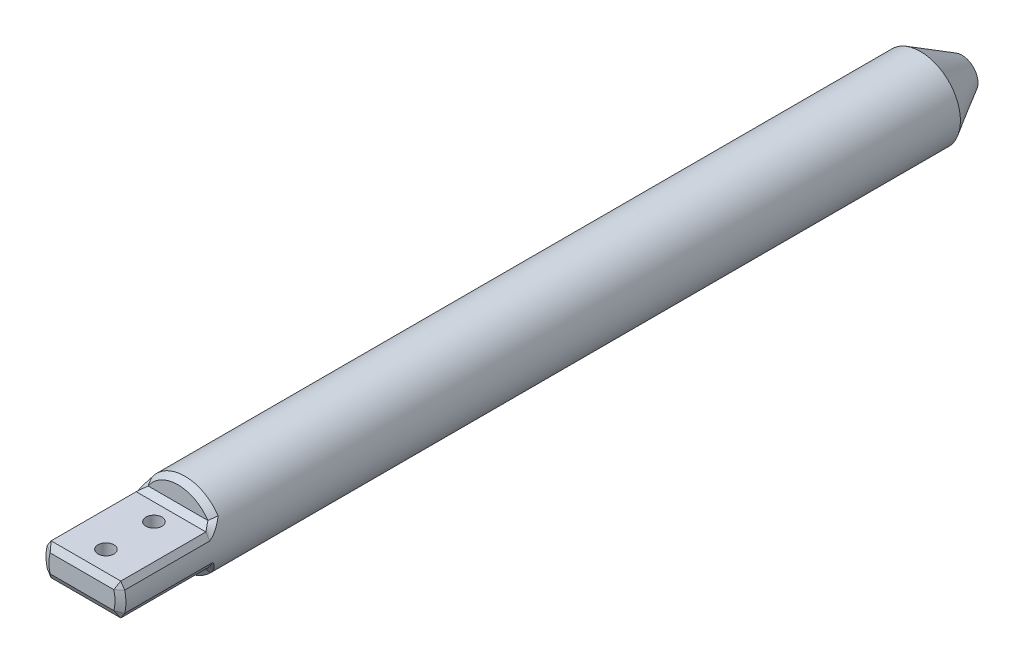
ISO-10303-21;
HEADER;
FILE_DESCRIPTION(('STEP AP214'),'2;1');
FILE_NAME('part.step','',(''),(''),'','','');
FILE_SCHEMA(('AUTOMOTIVE_DESIGN { 1 0 10303 214 1 1 1 1 }'));
ENDSEC;
DATA;
#1=APPLICATION_CONTEXT('core data for automotive mechanical design processes');
#2=APPLICATION_PROTOCOL_DEFINITION('international standard','automotive_design',2000,#1);
#3=PRODUCT_CONTEXT('',#1,'mechanical');
#4=PRODUCT('Part','Part','',(#3));
#5=PRODUCT_RELATED_PRODUCT_CATEGORY('part','',(#4));
#6=PRODUCT_DEFINITION_FORMATION('','',#4);
#7=PRODUCT_DEFINITION_CONTEXT('part definition',#1,'design');
#8=PRODUCT_DEFINITION('design','',#6,#7);
#9=PRODUCT_DEFINITION_SHAPE('','',#8);
#10=(LENGTH_UNIT() NAMED_UNIT(*) SI_UNIT(.MILLI.,.METRE.));
#11=(NAMED_UNIT(*) PLANE_ANGLE_UNIT() SI_UNIT($,.RADIAN.));
#12=(NAMED_UNIT(*) SI_UNIT($,.STERADIAN.) SOLID_ANGLE_UNIT());
#13=UNCERTAINTY_MEASURE_WITH_UNIT(LENGTH_MEASURE(1.E-05),#10,'distance_accuracy_value','');
#14=(GEOMETRIC_REPRESENTATION_CONTEXT(3) GLOBAL_UNCERTAINTY_ASSIGNED_CONTEXT((#13)) GLOBAL_UNIT_ASSIGNED_CONTEXT((#10,
#11,#12)) REPRESENTATION_CONTEXT('',''));
#15=CARTESIAN_POINT('',(0.,0.,0.));
#16=DIRECTION('',(0.,0.,1.));
#17=DIRECTION('',(1.,0.,0.));
#18=AXIS2_PLACEMENT_3D('',#15,#16,#17);
#19=CARTESIAN_POINT('',(0.,0.,110.));
#20=DIRECTION('',(0.,0.,-1.));
#21=DIRECTION('',(-1.,0.,0.));
#22=AXIS2_PLACEMENT_3D('',#19,#20,#21);
#23=CYLINDRICAL_SURFACE('',#22,5.);
#24=CARTESIAN_POINT('',(0.,0.,97.5));
#25=DIRECTION('',(0.,0.,1.));
#26=DIRECTION('',(1.,0.,0.));
#27=AXIS2_PLACEMENT_3D('',#24,#25,#26);
#28=CIRCLE('',#27,5.);
#29=CARTESIAN_POINT('',(3.60331431102539,-3.46642841783292,97.5));
#30=VERTEX_POINT('',#29);
#31=CARTESIAN_POINT('',(-3.60331431102539,-3.46642841783292,97.5));
#32=VERTEX_POINT('',#31);
#33=EDGE_CURVE('E603',#30,#32,#28,.F.);
#34=ORIENTED_EDGE('',*,*,#33,.T.);
#35=CARTESIAN_POINT('',(-4.83864352167007,-1.25997177357285,98.5));
#36=CARTESIAN_POINT('',(-4.83791114577477,-1.26278495482825,98.4946978248831));
#37=CARTESIAN_POINT('',(-4.83709577018911,-1.26590558939991,98.4895927835642));
#38=CARTESIAN_POINT('',(-4.83534131177357,-1.27259020517477,98.4797289513375));
#39=CARTESIAN_POINT('',(-4.83440269566841,-1.27615251101995,98.474968954316));
#40=CARTESIAN_POINT('',(-4.83147444635218,-1.28721117534268,98.4611672236894));
#41=CARTESIAN_POINT('',(-4.8293570416262,-1.29513865878249,98.4525058699072));
#42=CARTESIAN_POINT('',(-4.82296795322773,-1.31880017914286,98.428608200873));
#43=CARTESIAN_POINT('',(-4.81842942957423,-1.3353071419528,98.414233622582));
#44=CARTESIAN_POINT('',(-4.80888072189852,-1.3692999020264,98.3868612842947));
#45=CARTESIAN_POINT('',(-4.80386968090309,-1.38678745350685,98.3738661204037));
#46=CARTESIAN_POINT('',(-4.79337950997212,-1.4226267288188,98.34863068673));
#47=CARTESIAN_POINT('',(-4.78789393244556,-1.44098803322506,98.3364067590257));
#48=CARTESIAN_POINT('',(-4.77658218596247,-1.47805231913705,98.3127110717005));
#49=CARTESIAN_POINT('',(-4.77075637913052,-1.49675492330587,98.3012385389667));
#50=CARTESIAN_POINT('',(-4.75287903470475,-1.55295728881334,98.2678372368326));
#51=CARTESIAN_POINT('',(-4.7403528957484,-1.59080795853006,98.2467524992912));
#52=CARTESIAN_POINT('',(-4.71411921693592,-1.66694541992416,98.2061555446388));
#53=CARTESIAN_POINT('',(-4.70041120415756,-1.70523238081382,98.1866439631199));
#54=CARTESIAN_POINT('',(-4.65753757529481,-1.82045432872911,98.1298607433333));
#55=CARTESIAN_POINT('',(-4.62665474636726,-1.89764773362114,98.0943981647259));
#56=CARTESIAN_POINT('',(-4.56077692730352,-2.05090889943149,98.0270453815647));
#57=CARTESIAN_POINT('',(-4.52581878623369,-2.12698066420921,97.9951275891934));
#58=CARTESIAN_POINT('',(-4.45171487251678,-2.2780039456643,97.9337772548907));
#59=CARTESIAN_POINT('',(-4.41257211527258,-2.35295622523475,97.9043429503794));
#60=CARTESIAN_POINT('',(-4.33699380636204,-2.48907754548971,97.8521117313724));
#61=CARTESIAN_POINT('',(-4.30117777870619,-2.55047965329606,97.8290211626252));
#62=CARTESIAN_POINT('',(-4.22674785975603,-2.67201824569944,97.7839575746636));
#63=CARTESIAN_POINT('',(-4.18813298383377,-2.73215427519795,97.7619849534125));
#64=CARTESIAN_POINT('',(-4.10818437250475,-2.85095581894606,97.7189794346438));
#65=CARTESIAN_POINT('',(-4.06685005895411,-2.90962101681647,97.6979467385576));
#66=CARTESIAN_POINT('',(-3.98128492698696,-3.0256568581233,97.6565525855111));
#67=CARTESIAN_POINT('',(-3.93703767345193,-3.08301716445353,97.6361961244368));
#68=CARTESIAN_POINT('',(-3.84597525245467,-3.19589275652982,97.5961794342345));
#69=CARTESIAN_POINT('',(-3.79916059754885,-3.25140840701495,97.5765190674187));
#70=CARTESIAN_POINT('',(-3.70306669150843,-3.36044350451535,97.5378176614275));
#71=CARTESIAN_POINT('',(-3.65378849263906,-3.41396378705343,97.5187763634658));
#72=CARTESIAN_POINT('',(-3.60331431102539,-3.46642841783292,97.5));
#73=B_SPLINE_CURVE_WITH_KNOTS('',3,(#35,#36,#37,#38,#39,#40,#41,#42,#43,#44,#45,#46,#47,#48,#49,
#50,#51,#52,#53,#54,#55,#56,#57,#58,#59,#60,#61,#62,#63,#64,#65,#66,#67,#68,#69,#70,#71,#72),
.UNSPECIFIED.,.F.,.F.,(4,2,2,2,2,2,2,2,2,2,2,2,2,2,2,2,2,2,4),(0.,0.0181002082918333,
0.0361337464307406,0.0718579284492207,0.138771868201761,0.205809589128962,0.273973099392862,
0.342065336937103,0.477298371754491,0.612585772946951,0.883525739025791,1.15218233256534,
1.42064662268481,1.64479981007392,1.86903224036944,2.09331249678763,2.31898947279283,
2.54462155747039,2.77015807683253),.UNSPECIFIED.);
#74=CARTESIAN_POINT('',(-4.83864352167007,-1.25997177357285,98.5));
#75=VERTEX_POINT('',#74);
#76=EDGE_CURVE('E12',#32,#75,#73,.F.);
#77=ORIENTED_EDGE('',*,*,#76,.T.);
#78=DIRECTION('',(0.,0.,-1.));
#79=VECTOR('',#78,1.);
#80=CARTESIAN_POINT('',(-4.83864352167006,-1.25997177357285,110.));
#81=LINE('',#80,#79);
#82=CARTESIAN_POINT('',(-4.83864352167007,-1.25997177357285,109.5));
#83=VERTEX_POINT('',#82);
#84=EDGE_CURVE('E609',#75,#83,#81,.F.);
#85=ORIENTED_EDGE('',*,*,#84,.T.);
#86=CARTESIAN_POINT('',(0.,0.,109.5));
#87=DIRECTION('',(0.,0.,1.));
#88=DIRECTION('',(1.,0.,0.));
#89=AXIS2_PLACEMENT_3D('',#86,#87,#88);
#90=CIRCLE('',#89,5.);
#91=CARTESIAN_POINT('',(-4.83864352167006,1.25997177357285,109.5));
#92=VERTEX_POINT('',#91);
#93=EDGE_CURVE('E573',#83,#92,#90,.F.);
#94=ORIENTED_EDGE('',*,*,#93,.T.);
#95=DIRECTION('',(0.,0.,-1.));
#96=VECTOR('',#95,1.);
#97=CARTESIAN_POINT('',(-4.83864352167006,1.25997177357285,110.));
#98=LINE('',#97,#96);
#99=CARTESIAN_POINT('',(-4.83864352167006,1.25997177357285,98.8660254037844));
#100=VERTEX_POINT('',#99);
#101=EDGE_CURVE('E658',#92,#100,#98,.T.);
#102=ORIENTED_EDGE('',*,*,#101,.T.);
#103=CARTESIAN_POINT('',(-4.1573970964155,2.77777777777777,97.1339745962156));
#104=CARTESIAN_POINT('',(-4.18999144582304,2.7290066979412,97.1787698517985));
#105=CARTESIAN_POINT('',(-4.22163378587104,2.67977923219781,97.2237652760217));
#106=CARTESIAN_POINT('',(-4.28290834573235,2.58071153628058,97.314467466037));
#107=CARTESIAN_POINT('',(-4.31254016959463,2.53087118767541,97.3601743697815));
#108=CARTESIAN_POINT('',(-4.3698036588613,2.43067148976703,97.4528017566977));
#109=CARTESIAN_POINT('',(-4.39742569176498,2.38031081325133,97.4997267866347));
#110=CARTESIAN_POINT('',(-4.4504389150907,2.2796561285107,97.594877136005));
#111=CARTESIAN_POINT('',(-4.47583025415723,2.22936211606385,97.6431023685178));
#112=CARTESIAN_POINT('',(-4.54136428832915,2.09402864495546,97.7755610390604));
#113=CARTESIAN_POINT('',(-4.57934762961149,2.00938615272183,97.8613038400675));
#114=CARTESIAN_POINT('',(-4.63126118465874,1.88505755243007,97.994079313664));
#115=CARTESIAN_POINT('',(-4.64770295349641,1.8441084544682,98.0389666949668));
#116=CARTESIAN_POINT('',(-4.67894616188764,1.7633305646485,98.1303236282952));
#117=CARTESIAN_POINT('',(-4.69374718488855,1.72350205919315,98.176793578207));
#118=CARTESIAN_POINT('',(-4.72217298573088,1.64405629321745,98.2730125112414));
#119=CARTESIAN_POINT('',(-4.73574308092364,1.60448904523821,98.3228190712379));
#120=CARTESIAN_POINT('',(-4.76113594457901,1.5274893678067,98.4244517478379));
#121=CARTESIAN_POINT('',(-4.77295986022125,1.49005554678416,98.4762765100129));
#122=CARTESIAN_POINT('',(-4.78940368292854,1.43595695942918,98.5559453343732));
#123=CARTESIAN_POINT('',(-4.79468551616539,1.41820870130934,98.5829196240951));
#124=CARTESIAN_POINT('',(-4.8047864501276,1.38360106532777,98.6375110249733));
#125=CARTESIAN_POINT('',(-4.80960565297953,1.36674149165946,98.665127992577));
#126=CARTESIAN_POINT('',(-4.81877297359277,1.33405931891587,98.7211354781056));
#127=CARTESIAN_POINT('',(-4.82312002411845,1.31823909976782,98.7495275741319));
#128=CARTESIAN_POINT('',(-4.83128861397304,1.28798304259346,98.807138434298));
#129=CARTESIAN_POINT('',(-4.83510975318258,1.27354826112326,98.8363578076848));
#130=CARTESIAN_POINT('',(-4.83864352167006,1.25997177357285,98.8660254037844));
#131=B_SPLINE_CURVE_WITH_KNOTS('',3,(#103,#104,#105,#106,#107,#108,#109,#110,#111,#112,#113,
#114,#115,#116,#117,#118,#119,#120,#121,#122,#123,#124,#125,#126,#127,#128,#129,#130),
.UNSPECIFIED.,.F.,.F.,(4,2,2,2,2,2,2,2,2,2,2,2,2,4),(0.,0.221420341216524,0.442884163133895,
0.665347672896824,0.887796347321537,1.26642370584303,1.45521818859747,1.64406049326108,
1.83911249555734,2.03403577987126,2.13217432501867,2.23029115582921,2.32862534292581,
2.42703393505612),.UNSPECIFIED.);
#132=CARTESIAN_POINT('',(-4.1573970964155,2.77777777777777,97.1339745962156));
#133=VERTEX_POINT('',#132);
#134=EDGE_CURVE('E237',#133,#100,#131,.T.);
#135=ORIENTED_EDGE('',*,*,#134,.F.);
#136=CARTESIAN_POINT('',(0.,0.,97.1339745962156));
#137=DIRECTION('',(0.,0.,1.));
#138=DIRECTION('',(1.,0.,0.));
#139=AXIS2_PLACEMENT_3D('',#136,#137,#138);
#140=CIRCLE('',#139,5.);
#141=CARTESIAN_POINT('',(4.1573970964155,2.77777777777777,97.1339745962156));
#142=VERTEX_POINT('',#141);
#143=EDGE_CURVE('E218',#133,#142,#140,.F.);
#144=ORIENTED_EDGE('',*,*,#143,.T.);
#145=CARTESIAN_POINT('',(4.83864352167006,1.25997177357286,98.8660254037844));
#146=CARTESIAN_POINT('',(4.83458898174738,1.27555187103196,98.8320096043417));
#147=CARTESIAN_POINT('',(4.83016020376759,1.29224270478878,98.7985803966234));
#148=CARTESIAN_POINT('',(4.82062035095089,1.32738221084305,98.7327966258347));
#149=CARTESIAN_POINT('',(4.81550994098627,1.34582916524185,98.7004410534537));
#150=CARTESIAN_POINT('',(4.8046790909688,1.38399921384581,98.6367240544075));
#151=CARTESIAN_POINT('',(4.79896028099469,1.40371884500808,98.6053602494305));
#152=CARTESIAN_POINT('',(4.78692333116714,1.44423399416857,98.5434434058922));
#153=CARTESIAN_POINT('',(4.78060502210925,1.46502981515652,98.5128905993622));
#154=CARTESIAN_POINT('',(4.76087506170675,1.52840181261237,98.4228127261823));
#155=CARTESIAN_POINT('',(4.74660402744602,1.57226441194057,98.364377789047));
#156=CARTESIAN_POINT('',(4.71577497290737,1.66245097910402,98.2500203219606));
#157=CARTESIAN_POINT('',(4.69921526991065,1.70877674239095,98.1940996810838));
#158=CARTESIAN_POINT('',(4.66647976249786,1.79605060525544,98.092830457192));
#159=CARTESIAN_POINT('',(4.65062545190627,1.83675094003219,98.0471631236932));
#160=CARTESIAN_POINT('',(4.61725810005428,1.91908910791679,97.9573373290821));
#161=CARTESIAN_POINT('',(4.59974557821099,1.96072664436137,97.9131784013367));
#162=CARTESIAN_POINT('',(4.54461200746628,2.08684331910976,97.7825192959063));
#163=CARTESIAN_POINT('',(4.50446500397664,2.17233676726361,97.6980524961803));
#164=CARTESIAN_POINT('',(4.41684267594027,2.34543613145525,97.5319420664484));
#165=CARTESIAN_POINT('',(4.36925498024934,2.43305333186046,97.4503702620225));
#166=CARTESIAN_POINT('',(4.29316003966695,2.56345596721803,97.3302724402948));
#167=CARTESIAN_POINT('',(4.26705677973543,2.60668197007473,97.2906804328565));
#168=CARTESIAN_POINT('',(4.21334050705385,2.69264457746538,97.2120008845296));
#169=CARTESIAN_POINT('',(4.18572762356588,2.73538122352288,97.1729133008026));
#170=CARTESIAN_POINT('',(4.1573970964155,2.77777777777777,97.1339745962156));
#171=B_SPLINE_CURVE_WITH_KNOTS('',3,(#145,#146,#147,#148,#149,#150,#151,#152,#153,#154,#155,
#156,#157,#158,#159,#160,#161,#162,#163,#164,#165,#166,#167,#168,#169,#170),.UNSPECIFIED.,.F.,
.F.,(4,2,2,2,2,2,2,2,2,2,2,2,4),(0.,0.112833247447271,0.225557230003366,0.337986456353896,
0.450447510003236,0.673627588001006,0.896972638416056,1.08650154942326,1.27597128767746,
1.65579569547722,2.04203842998577,2.23452088078048,2.42698687592764),.UNSPECIFIED.);
#172=CARTESIAN_POINT('',(4.83864352167006,1.25997177357286,98.8660254037844));
#173=VERTEX_POINT('',#172);
#174=EDGE_CURVE('E208',#173,#142,#171,.T.);
#175=ORIENTED_EDGE('',*,*,#174,.F.);
#176=DIRECTION('',(0.,0.,-1.));
#177=VECTOR('',#176,1.);
#178=CARTESIAN_POINT('',(4.83864352167006,1.25997177357286,110.));
#179=LINE('',#178,#177);
#180=CARTESIAN_POINT('',(4.83864352167006,1.25997177357286,109.5));
#181=VERTEX_POINT('',#180);
#182=EDGE_CURVE('E656',#173,#181,#179,.F.);
#183=ORIENTED_EDGE('',*,*,#182,.T.);
#184=CARTESIAN_POINT('',(0.,0.,109.5));
#185=DIRECTION('',(0.,0.,1.));
#186=DIRECTION('',(1.,0.,0.));
#187=AXIS2_PLACEMENT_3D('',#184,#185,#186);
#188=CIRCLE('',#187,5.);
#189=CARTESIAN_POINT('',(4.83864352167007,-1.25997177357285,109.5));
#190=VERTEX_POINT('',#189);
#191=EDGE_CURVE('E653',#181,#190,#188,.F.);
#192=ORIENTED_EDGE('',*,*,#191,.T.);
#193=DIRECTION('',(0.,0.,-1.));
#194=VECTOR('',#193,1.);
#195=CARTESIAN_POINT('',(4.83864352167006,-1.25997177357285,110.));
#196=LINE('',#195,#194);
#197=CARTESIAN_POINT('',(4.83864352167007,-1.25997177357285,98.5));
#198=VERTEX_POINT('',#197);
#199=EDGE_CURVE('E647',#190,#198,#196,.T.);
#200=ORIENTED_EDGE('',*,*,#199,.T.);
#201=CARTESIAN_POINT('',(3.60331431102539,-3.46642841783292,97.5));
#202=CARTESIAN_POINT('',(3.65202035345034,-3.41580000550394,97.5181174534395));
#203=CARTESIAN_POINT('',(3.69960888203647,-3.36419525857177,97.5364817461299));
#204=CARTESIAN_POINT('',(3.79247760551225,-3.25914529307435,97.5737764898679));
#205=CARTESIAN_POINT('',(3.83775778165333,-3.20570005956647,97.5927069455118));
#206=CARTESIAN_POINT('',(3.9700449425102,-3.04274820318422,97.6504646872862));
#207=CARTESIAN_POINT('',(4.0534760852437,-2.93064881859808,97.6902500802594));
#208=CARTESIAN_POINT('',(4.21470240041271,-2.69405452156694,97.7756736011546));
#209=CARTESIAN_POINT('',(4.29188933373346,-2.56921779847032,97.8215174053492));
#210=CARTESIAN_POINT('',(4.39862282431041,-2.3785367925896,97.8944625768151));
#211=CARTESIAN_POINT('',(4.43269737924955,-2.31439534530826,97.9194783791065));
#212=CARTESIAN_POINT('',(4.49776337436799,-2.18525694452054,97.9712316893919));
#213=CARTESIAN_POINT('',(4.52875531797972,-2.12026013267656,97.9979689150752));
#214=CARTESIAN_POINT('',(4.58874986728373,-1.98718515525398,98.0546897555812));
#215=CARTESIAN_POINT('',(4.61762624175262,-1.91908636355318,98.0847597055306));
#216=CARTESIAN_POINT('',(4.65829532127212,-1.81703744075019,98.1321760201679));
#217=CARTESIAN_POINT('',(4.671401712461,-1.78306373683589,98.14835337799));
#218=CARTESIAN_POINT('',(4.69672470303182,-1.71525120944844,98.1816513115703));
#219=CARTESIAN_POINT('',(4.70894140152076,-1.68141237135013,98.1987717818965));
#220=CARTESIAN_POINT('',(4.7344813632306,-1.6082385185814,98.2372253160211));
#221=CARTESIAN_POINT('',(4.74763467953905,-1.56895698307482,98.2587770714112));
#222=CARTESIAN_POINT('',(4.76638082366708,-1.51064028530392,98.2928707529368));
#223=CARTESIAN_POINT('',(4.77247637400516,-1.49126551685596,98.3045539202937));
#224=CARTESIAN_POINT('',(4.78430325182178,-1.45287496610896,98.3286604459148));
#225=CARTESIAN_POINT('',(4.79003467546799,-1.43385908996512,98.3410836070494));
#226=CARTESIAN_POINT('',(4.80157955170935,-1.3947340328673,98.3680430633048));
#227=CARTESIAN_POINT('',(4.80735652649025,-1.37467423035488,98.3826691570357));
#228=CARTESIAN_POINT('',(4.81554456701524,-1.34559714930494,98.4058937878424));
#229=CARTESIAN_POINT('',(4.81818507608973,-1.33610819699121,98.4138166160376));
#230=CARTESIAN_POINT('',(4.82327882237037,-1.31760126242381,98.4302514772549));
#231=CARTESIAN_POINT('',(4.82573212707753,-1.30858311078574,98.4387632957713));
#232=CARTESIAN_POINT('',(4.8300997457424,-1.29236135385335,98.4555281047136));
#233=CARTESIAN_POINT('',(4.83204330993397,-1.28507054589167,98.4636862382102));
#234=CARTESIAN_POINT('',(4.83473333568819,-1.27489844606433,98.4766405978463));
#235=CARTESIAN_POINT('',(4.83559549253994,-1.27162337958873,98.4810978183009));
#236=CARTESIAN_POINT('',(4.83721074719702,-1.26546539508924,98.4903123643399));
#237=CARTESIAN_POINT('',(4.83796349013983,-1.26258375482313,98.4950705976104));
#238=CARTESIAN_POINT('',(4.83864352166735,-1.25997177357769,98.4999999999978));
#239=B_SPLINE_CURVE_WITH_KNOTS('',3,(#201,#202,#203,#204,#205,#206,#207,#208,#209,#210,#211,
#212,#213,#214,#215,#216,#217,#218,#219,#220,#221,#222,#223,#224,#225,#226,#227,#228,#229,#230,
#231,#232,#233,#234,#235,#236,#237,#238),.UNSPECIFIED.,.F.,.F.,(4,2,2,2,2,2,2,2,2,2,2,2,2,2,2,2,
2,2,4),(0.,0.217625187499162,0.435252142281957,0.870606166500743,1.3312303484465,
1.56161329193997,1.79195854876834,2.0313659227303,2.15088612661754,2.27039299616369,
2.41041087147184,2.48069161482942,2.55095371886457,2.62734649906397,2.66525191129714,
2.70314359060441,2.73641782304225,2.75319169163709,2.77001880393019),.UNSPECIFIED.);
#240=EDGE_CURVE('E55',#198,#30,#239,.F.);
#241=ORIENTED_EDGE('',*,*,#240,.T.);
#242=EDGE_LOOP('',(#34,#77,#85,#94,#102,#135,#144,#175,#183,#192,#200,#241));
#243=FACE_BOUND('',#242,.T.);
#244=CARTESIAN_POINT('',(0.,0.,5.19615242270667));
#245=DIRECTION('',(0.,0.,1.));
#246=DIRECTION('',(1.,0.,0.));
#247=AXIS2_PLACEMENT_3D('',#244,#245,#246);
#248=CIRCLE('',#247,5.);
#249=CARTESIAN_POINT('',(5.,0.,5.19615242270667));
#250=VERTEX_POINT('',#249);
#251=EDGE_CURVE('E550',#250,#250,#248,.T.);
#252=ORIENTED_EDGE('',*,*,#251,.T.);
#253=EDGE_LOOP('',(#252));
#254=FACE_BOUND('',#253,.T.);
#255=ADVANCED_FACE('F44',(#243,#254),#23,.T.);
#256=CARTESIAN_POINT('',(0.,0.,110.));
#257=DIRECTION('',(0.,0.,1.));
#258=DIRECTION('',(1.,0.,0.));
#259=AXIS2_PLACEMENT_3D('',#256,#257,#258);
#260=PLANE('',#259);
#261=CARTESIAN_POINT('',(0.,0.,110.));
#262=DIRECTION('',(0.,0.,1.));
#263=DIRECTION('',(1.,0.,0.));
#264=AXIS2_PLACEMENT_3D('',#261,#262,#263);
#265=CIRCLE('',#264,4.13397459621556);
#266=CARTESIAN_POINT('',(-3.97540533496817,1.13397459621556,110.));
#267=VERTEX_POINT('',#266);
#268=CARTESIAN_POINT('',(-3.97540533496817,-1.13397459621556,110.));
#269=VERTEX_POINT('',#268);
#270=EDGE_CURVE('E189',#267,#269,#265,.T.);
#271=ORIENTED_EDGE('',*,*,#270,.T.);
#272=DIRECTION('',(1.,0.,0.));
#273=VECTOR('',#272,1.);
#274=CARTESIAN_POINT('',(0.,-1.13397459621556,110.));
#275=LINE('',#274,#273);
#276=CARTESIAN_POINT('',(3.97540533496817,-1.13397459621556,110.));
#277=VERTEX_POINT('',#276);
#278=EDGE_CURVE('E156',#269,#277,#275,.T.);
#279=ORIENTED_EDGE('',*,*,#278,.T.);
#280=CARTESIAN_POINT('',(0.,0.,110.));
#281=DIRECTION('',(0.,0.,1.));
#282=DIRECTION('',(1.,0.,0.));
#283=AXIS2_PLACEMENT_3D('',#280,#281,#282);
#284=CIRCLE('',#283,4.13397459621556);
#285=CARTESIAN_POINT('',(3.97540533496817,1.13397459621556,110.));
#286=VERTEX_POINT('',#285);
#287=EDGE_CURVE('E177',#277,#286,#284,.T.);
#288=ORIENTED_EDGE('',*,*,#287,.T.);
#289=DIRECTION('',(-1.,0.,0.));
#290=VECTOR('',#289,1.);
#291=CARTESIAN_POINT('',(0.,1.13397459621556,110.));
#292=LINE('',#291,#290);
#293=EDGE_CURVE('E184',#286,#267,#292,.T.);
#294=ORIENTED_EDGE('',*,*,#293,.T.);
#295=EDGE_LOOP('',(#271,#279,#288,#294));
#296=FACE_BOUND('',#295,.T.);
#297=ADVANCED_FACE('F187',(#296),#260,.T.);
#298=CARTESIAN_POINT('',(0.,0.,0.));
#299=DIRECTION('',(0.,0.,1.));
#300=DIRECTION('',(1.,0.,0.));
#301=AXIS2_PLACEMENT_3D('',#298,#299,#300);
#302=PLANE('',#301);
#303=CARTESIAN_POINT('',(0.,0.,0.));
#304=DIRECTION('',(0.,0.,1.));
#305=DIRECTION('',(1.,0.,0.));
#306=AXIS2_PLACEMENT_3D('',#303,#304,#305);
#307=CIRCLE('',#306,1.99999999999997);
#308=CARTESIAN_POINT('',(1.99999999999997,0.,0.));
#309=VERTEX_POINT('',#308);
#310=EDGE_CURVE('E185',#309,#309,#307,.F.);
#311=ORIENTED_EDGE('',*,*,#310,.T.);
#312=EDGE_LOOP('',(#311));
#313=FACE_BOUND('',#312,.T.);
#314=ADVANCED_FACE('F230',(#313),#302,.F.);
#315=CARTESIAN_POINT('',(0.,0.,5.19615242270667));
#316=DIRECTION('',(0.,0.,1.));
#317=DIRECTION('',(1.,0.,0.));
#318=AXIS2_PLACEMENT_3D('',#315,#316,#317);
#319=CONICAL_SURFACE('',#318,5.,0.5235987755983);
#320=ORIENTED_EDGE('',*,*,#310,.F.);
#321=EDGE_LOOP('',(#320));
#322=FACE_BOUND('',#321,.T.);
#323=ORIENTED_EDGE('',*,*,#251,.F.);
#324=EDGE_LOOP('',(#323));
#325=FACE_BOUND('',#324,.T.);
#326=ADVANCED_FACE('F233',(#322,#325),#319,.T.);
#327=CARTESIAN_POINT('',(-5.,-2.,98.));
#328=DIRECTION('',(0.,-1.,0.));
#329=DIRECTION('',(1.,0.,0.));
#330=AXIS2_PLACEMENT_3D('',#327,#328,#329);
#331=PLANE('',#330);
#332=CARTESIAN_POINT('',(0.,-2.,101.));
#333=DIRECTION('',(0.,-1.,0.));
#334=DIRECTION('',(1.,0.,0.));
#335=AXIS2_PLACEMENT_3D('',#332,#333,#334);
#336=CIRCLE('',#335,0.999999999999988);
#337=CARTESIAN_POINT('',(0.999999999999983,-2.,101.));
#338=VERTEX_POINT('',#337);
#339=EDGE_CURVE('E871',#338,#338,#336,.T.);
#340=ORIENTED_EDGE('',*,*,#339,.F.);
#341=EDGE_LOOP('',(#340));
#342=FACE_BOUND('',#341,.T.);
#343=CARTESIAN_POINT('',(0.,-2.,107.));
#344=DIRECTION('',(0.,-1.,0.));
#345=DIRECTION('',(1.,0.,0.));
#346=AXIS2_PLACEMENT_3D('',#343,#344,#345);
#347=CIRCLE('',#346,0.999999999999988);
#348=CARTESIAN_POINT('',(0.999999999999988,-2.,107.));
#349=VERTEX_POINT('',#348);
#350=EDGE_CURVE('E163',#349,#349,#347,.T.);
#351=ORIENTED_EDGE('',*,*,#350,.F.);
#352=EDGE_LOOP('',(#351));
#353=FACE_BOUND('',#352,.T.);
#354=DIRECTION('',(0.,0.,1.));
#355=VECTOR('',#354,1.);
#356=CARTESIAN_POINT('',(4.35477916950306,-2.,110.));
#357=LINE('',#356,#355);
#358=CARTESIAN_POINT('',(4.35477916950306,-2.,98.5));
#359=VERTEX_POINT('',#358);
#360=CARTESIAN_POINT('',(4.35477916950306,-2.,109.5));
#361=VERTEX_POINT('',#360);
#362=EDGE_CURVE('E196',#359,#361,#357,.T.);
#363=ORIENTED_EDGE('',*,*,#362,.T.);
#364=DIRECTION('',(-1.,0.,0.));
#365=VECTOR('',#364,1.);
#366=CARTESIAN_POINT('',(-5.,-2.,109.5));
#367=LINE('',#366,#365);
#368=CARTESIAN_POINT('',(-4.35477916950306,-2.,109.5));
#369=VERTEX_POINT('',#368);
#370=EDGE_CURVE('E158',#361,#369,#367,.T.);
#371=ORIENTED_EDGE('',*,*,#370,.T.);
#372=DIRECTION('',(0.,0.,-1.));
#373=VECTOR('',#372,1.);
#374=CARTESIAN_POINT('',(-4.35477916950306,-2.,98.));
#375=LINE('',#374,#373);
#376=CARTESIAN_POINT('',(-4.35477916950306,-2.,98.5));
#377=VERTEX_POINT('',#376);
#378=EDGE_CURVE('E203',#369,#377,#375,.T.);
#379=ORIENTED_EDGE('',*,*,#378,.T.);
#380=DIRECTION('',(1.,0.,0.));
#381=VECTOR('',#380,1.);
#382=CARTESIAN_POINT('',(4.58257569495584,-2.,98.5));
#383=LINE('',#382,#381);
#384=EDGE_CURVE('E192',#377,#359,#383,.T.);
#385=ORIENTED_EDGE('',*,*,#384,.T.);
#386=EDGE_LOOP('',(#363,#371,#379,#385));
#387=FACE_BOUND('',#386,.T.);
#388=ADVANCED_FACE('F642',(#342,#353,#387),#331,.T.);
#389=CARTESIAN_POINT('',(0.,0.,98.));
#390=DIRECTION('',(0.,0.,1.));
#391=DIRECTION('',(1.,0.,0.));
#392=AXIS2_PLACEMENT_3D('',#389,#390,#391);
#393=PLANE('',#392);
#394=CARTESIAN_POINT('',(0.,0.,98.));
#395=DIRECTION('',(0.,0.,1.));
#396=DIRECTION('',(1.,0.,0.));
#397=AXIS2_PLACEMENT_3D('',#394,#395,#396);
#398=CIRCLE('',#397,4.13397459621556);
#399=CARTESIAN_POINT('',(-2.97920196479179,-2.8660254037842,98.));
#400=VERTEX_POINT('',#399);
#401=CARTESIAN_POINT('',(2.97920196479179,-2.8660254037842,98.));
#402=VERTEX_POINT('',#401);
#403=EDGE_CURVE('E617',#400,#402,#398,.T.);
#404=ORIENTED_EDGE('',*,*,#403,.T.);
#405=DIRECTION('',(-1.,0.,0.));
#406=VECTOR('',#405,1.);
#407=CARTESIAN_POINT('',(-4.58257569495584,-2.86602540378444,98.));
#408=LINE('',#407,#406);
#409=EDGE_CURVE('E620',#402,#400,#408,.T.);
#410=ORIENTED_EDGE('',*,*,#409,.T.);
#411=EDGE_LOOP('',(#404,#410));
#412=FACE_BOUND('',#411,.T.);
#413=ADVANCED_FACE('F626',(#412),#393,.T.);
#414=DIRECTION('',(1.,0.,0.));
#415=VECTOR('',#414,1.);
#416=CARTESIAN_POINT('',(4.58257569495584,2.49999999999999,98.));
#417=LINE('',#416,#415);
#418=CARTESIAN_POINT('',(-3.74165738677395,2.49999999999999,98.));
#419=VERTEX_POINT('',#418);
#420=CARTESIAN_POINT('',(3.74165738677395,2.49999999999999,98.));
#421=VERTEX_POINT('',#420);
#422=EDGE_CURVE('E62',#419,#421,#417,.T.);
#423=ORIENTED_EDGE('',*,*,#422,.T.);
#424=CARTESIAN_POINT('',(0.,0.,98.));
#425=DIRECTION('',(0.,0.,1.));
#426=DIRECTION('',(1.,0.,0.));
#427=AXIS2_PLACEMENT_3D('',#424,#425,#426);
#428=CIRCLE('',#427,4.50000000000001);
#429=EDGE_CURVE('E251',#421,#419,#428,.T.);
#430=ORIENTED_EDGE('',*,*,#429,.T.);
#431=EDGE_LOOP('',(#423,#430));
#432=FACE_BOUND('',#431,.T.);
#433=ADVANCED_FACE('F809',(#432),#393,.T.);
#434=CARTESIAN_POINT('',(-5.,2.,98.));
#435=DIRECTION('',(0.,1.,0.));
#436=DIRECTION('',(-1.,0.,0.));
#437=AXIS2_PLACEMENT_3D('',#434,#435,#436);
#438=PLANE('',#437);
#439=CARTESIAN_POINT('',(0.,2.,101.));
#440=DIRECTION('',(0.,1.,0.));
#441=DIRECTION('',(0.,0.,1.));
#442=AXIS2_PLACEMENT_3D('',#439,#440,#441);
#443=CIRCLE('',#442,0.999999999999989);
#444=CARTESIAN_POINT('',(0.,2.,102.));
#445=VERTEX_POINT('',#444);
#446=EDGE_CURVE('E881',#445,#445,#443,.T.);
#447=ORIENTED_EDGE('',*,*,#446,.F.);
#448=EDGE_LOOP('',(#447));
#449=FACE_BOUND('',#448,.T.);
#450=CARTESIAN_POINT('',(0.,2.,107.));
#451=DIRECTION('',(0.,1.,0.));
#452=DIRECTION('',(0.,0.,1.));
#453=AXIS2_PLACEMENT_3D('',#450,#451,#452);
#454=CIRCLE('',#453,0.999999999999989);
#455=CARTESIAN_POINT('',(0.,2.,108.));
#456=VERTEX_POINT('',#455);
#457=EDGE_CURVE('E875',#456,#456,#454,.T.);
#458=ORIENTED_EDGE('',*,*,#457,.F.);
#459=EDGE_LOOP('',(#458));
#460=FACE_BOUND('',#459,.T.);
#461=DIRECTION('',(0.,0.,1.));
#462=VECTOR('',#461,1.);
#463=CARTESIAN_POINT('',(-4.35477916950306,2.,110.));
#464=LINE('',#463,#462);
#465=CARTESIAN_POINT('',(-4.35477916950306,2.,98.8660254037844));
#466=VERTEX_POINT('',#465);
#467=CARTESIAN_POINT('',(-4.35477916950306,2.,109.5));
#468=VERTEX_POINT('',#467);
#469=EDGE_CURVE('E602',#466,#468,#464,.T.);
#470=ORIENTED_EDGE('',*,*,#469,.T.);
#471=DIRECTION('',(1.,0.,0.));
#472=VECTOR('',#471,1.);
#473=CARTESIAN_POINT('',(-5.,2.,109.5));
#474=LINE('',#473,#472);
#475=CARTESIAN_POINT('',(4.35477916950306,2.,109.5));
#476=VERTEX_POINT('',#475);
#477=EDGE_CURVE('E567',#468,#476,#474,.T.);
#478=ORIENTED_EDGE('',*,*,#477,.T.);
#479=DIRECTION('',(0.,0.,-1.));
#480=VECTOR('',#479,1.);
#481=CARTESIAN_POINT('',(4.35477916950306,2.,98.));
#482=LINE('',#481,#480);
#483=CARTESIAN_POINT('',(4.35477916950306,2.,98.8660254037844));
#484=VERTEX_POINT('',#483);
#485=EDGE_CURVE('E607',#476,#484,#482,.T.);
#486=ORIENTED_EDGE('',*,*,#485,.T.);
#487=DIRECTION('',(-1.,0.,0.));
#488=VECTOR('',#487,1.);
#489=CARTESIAN_POINT('',(-4.58257569495584,2.,98.8660254037844));
#490=LINE('',#489,#488);
#491=EDGE_CURVE('E599',#484,#466,#490,.T.);
#492=ORIENTED_EDGE('',*,*,#491,.T.);
#493=EDGE_LOOP('',(#470,#478,#486,#492));
#494=FACE_BOUND('',#493,.T.);
#495=ADVANCED_FACE('F802',(#449,#460,#494),#438,.T.);
#496=CARTESIAN_POINT('',(-5.,2.,98.8660254037844));
#497=DIRECTION('',(0.,0.866025403784439,0.499999999999999));
#498=DIRECTION('',(1.,0.,0.));
#499=AXIS2_PLACEMENT_3D('',#496,#497,#498);
#500=PLANE('',#499);
#501=CARTESIAN_POINT('',(3.74165738677395,2.49999999999999,98.));
#502=CARTESIAN_POINT('',(3.82349449456611,2.43326194722043,98.1155936982124));
#503=CARTESIAN_POINT('',(3.90533160235826,2.36652389444087,98.2311873964248));
#504=CARTESIAN_POINT('',(4.04843712004252,2.24982153471776,98.4333218128285));
#505=CARTESIAN_POINT('',(4.10970552993463,2.19985722777421,98.5198625310197));
#506=CARTESIAN_POINT('',(4.23224234971884,2.0999286138871,98.6929439674021));
#507=CARTESIAN_POINT('',(4.29351075961095,2.04996430694355,98.7794846855932));
#508=CARTESIAN_POINT('',(4.35477916950306,2.,98.8660254037844));
#509=B_SPLINE_CURVE_WITH_KNOTS('',3,(#501,#502,#503,#504,#505,#506,#507,#508),.UNSPECIFIED.,.F.,
.F.,(4,2,2,4),(0.,0.469700592615267,0.821348020185772,1.17299544775626),.UNSPECIFIED.);
#510=EDGE_CURVE('E499',#421,#484,#509,.T.);
#511=ORIENTED_EDGE('',*,*,#510,.F.);
#512=ORIENTED_EDGE('',*,*,#422,.F.);
#513=CARTESIAN_POINT('',(-4.35477916950306,2.,98.8660254037844));
#514=CARTESIAN_POINT('',(-4.2642220995089,2.07384917038103,98.7381148885877));
#515=CARTESIAN_POINT('',(-4.17366502951473,2.14769834076206,98.6102043733909));
#516=CARTESIAN_POINT('',(-4.02619953072946,2.26795625928591,98.4019115484951));
#517=CARTESIAN_POINT('',(-3.96929110193836,2.31436500742872,98.3215292387961));
#518=CARTESIAN_POINT('',(-3.85547424435616,2.40718250371436,98.1607646193981));
#519=CARTESIAN_POINT('',(-3.79856581556506,2.45359125185717,98.080382309699));
#520=CARTESIAN_POINT('',(-3.74165738677395,2.49999999999999,98.));
#521=B_SPLINE_CURVE_WITH_KNOTS('',3,(#513,#514,#515,#516,#517,#518,#519,#520),.UNSPECIFIED.,.F.,
.F.,(4,2,2,4),(0.,0.519748444065151,0.84637194591071,1.17299544775626),.UNSPECIFIED.);
#522=EDGE_CURVE('E70',#466,#419,#521,.T.);
#523=ORIENTED_EDGE('',*,*,#522,.F.);
#524=ORIENTED_EDGE('',*,*,#491,.F.);
#525=EDGE_LOOP('',(#511,#512,#523,#524));
#526=FACE_BOUND('',#525,.T.);
#527=ADVANCED_FACE('F490',(#526),#500,.T.);
#528=CARTESIAN_POINT('',(0.,0.,98.));
#529=DIRECTION('',(0.,0.,-1.));
#530=DIRECTION('',(-1.,0.,0.));
#531=AXIS2_PLACEMENT_3D('',#528,#529,#530);
#532=CONICAL_SURFACE('',#531,4.50000000000001,0.523598775598298);
#533=DIRECTION('',(-0.415739709641549,-0.277777777777776,0.866025403784439));
#534=VECTOR('',#533,1.);
#535=CARTESIAN_POINT('',(4.1573970964155,2.77777777777777,97.1339745962156));
#536=LINE('',#535,#534);
#537=EDGE_CURVE('E507',#142,#421,#536,.T.);
#538=ORIENTED_EDGE('',*,*,#537,.F.);
#539=ORIENTED_EDGE('',*,*,#143,.F.);
#540=DIRECTION('',(-0.41573970964155,0.277777777777776,-0.866025403784439));
#541=VECTOR('',#540,1.);
#542=CARTESIAN_POINT('',(-3.74165738677395,2.49999999999999,98.));
#543=LINE('',#542,#541);
#544=EDGE_CURVE('E49',#419,#133,#543,.T.);
#545=ORIENTED_EDGE('',*,*,#544,.F.);
#546=ORIENTED_EDGE('',*,*,#429,.F.);
#547=EDGE_LOOP('',(#538,#539,#545,#546));
#548=FACE_BOUND('',#547,.T.);
#549=ADVANCED_FACE('F47',(#548),#532,.T.);
#550=CARTESIAN_POINT('',(-3.74165738677395,2.49999999999999,98.));
#551=CARTESIAN_POINT('',(-4.35477916950306,2.,98.8660254037844));
#552=CARTESIAN_POINT('',(-4.1573970964155,2.77777777777777,97.1339745962156));
#553=CARTESIAN_POINT('',(-4.83864352167006,1.25997177357285,98.8660254037844));
#554=CARTESIAN_POINT('',(-4.25776042170235,2.84483584517433,96.9249082325968));
#555=CARTESIAN_POINT('',(-4.95545275168834,1.08132226791366,98.8660254037844));
#556=B_SPLINE_SURFACE_WITH_KNOTS('',1,1,((#550,#551),(#552,#553),(#554,#555)),.UNSPECIFIED.,.F.,
.F.,.F.,(2,1,2),(2,2),(0.,1.,1.24140904262762),(0.,1.),.UNSPECIFIED.);
#557=DIRECTION('',(0.547249159032968,0.83696974732526,0.));
#558=VECTOR('',#557,1.);
#559=CARTESIAN_POINT('',(-4.83864352167006,1.25997177357285,98.8660254037844));
#560=LINE('',#559,#558);
#561=EDGE_CURVE('E590',#466,#100,#560,.F.);
#562=ORIENTED_EDGE('',*,*,#544,.T.);
#563=ORIENTED_EDGE('',*,*,#134,.T.);
#564=ORIENTED_EDGE('',*,*,#561,.F.);
#565=ORIENTED_EDGE('',*,*,#522,.T.);
#566=EDGE_LOOP('',(#562,#563,#564,#565));
#567=FACE_BOUND('',#566,.T.);
#568=ADVANCED_FACE('F524',(#567),#556,.T.);
#569=CARTESIAN_POINT('',(4.35477916950306,2.,98.8660254037844));
#570=CARTESIAN_POINT('',(3.74165738677395,2.49999999999999,98.));
#571=CARTESIAN_POINT('',(4.83864352167006,1.25997177357286,98.8660254037844));
#572=CARTESIAN_POINT('',(4.1573970964155,2.77777777777777,97.1339745962156));
#573=CARTESIAN_POINT('',(4.95439981451483,1.08293264327104,98.8660254037844));
#574=CARTESIAN_POINT('',(4.25685573055736,2.84423137297693,96.9267927904005));
#575=B_SPLINE_SURFACE_WITH_KNOTS('',1,1,((#569,#570),(#571,#572),(#573,#574)),.UNSPECIFIED.,.F.,
.F.,.F.,(2,1,2),(2,2),(0.,1.,1.23923294271701),(0.,1.),.UNSPECIFIED.);
#576=DIRECTION('',(0.547249159032968,-0.83696974732526,0.));
#577=VECTOR('',#576,1.);
#578=CARTESIAN_POINT('',(4.35477916950306,2.,98.8660254037844));
#579=LINE('',#578,#577);
#580=EDGE_CURVE('E423',#173,#484,#579,.F.);
#581=ORIENTED_EDGE('',*,*,#537,.T.);
#582=ORIENTED_EDGE('',*,*,#510,.T.);
#583=ORIENTED_EDGE('',*,*,#580,.F.);
#584=ORIENTED_EDGE('',*,*,#174,.T.);
#585=EDGE_LOOP('',(#581,#582,#583,#584));
#586=FACE_BOUND('',#585,.T.);
#587=ADVANCED_FACE('F481',(#586),#575,.T.);
#588=CARTESIAN_POINT('',(-4.35477916950306,2.,110.));
#589=DIRECTION('',(-0.83696974732526,0.547249159032968,0.));
#590=DIRECTION('',(0.,0.,-1.));
#591=AXIS2_PLACEMENT_3D('',#588,#589,#590);
#592=PLANE('',#591);
#593=ORIENTED_EDGE('',*,*,#561,.T.);
#594=ORIENTED_EDGE('',*,*,#101,.F.);
#595=DIRECTION('',(-0.547249159032968,-0.83696974732526,0.));
#596=VECTOR('',#595,1.);
#597=CARTESIAN_POINT('',(-4.83864352167006,1.25997177357285,109.5));
#598=LINE('',#597,#596);
#599=EDGE_CURVE('E407',#468,#92,#598,.T.);
#600=ORIENTED_EDGE('',*,*,#599,.F.);
#601=ORIENTED_EDGE('',*,*,#469,.F.);
#602=EDGE_LOOP('',(#593,#594,#600,#601));
#603=FACE_BOUND('',#602,.T.);
#604=ADVANCED_FACE('F474',(#603),#592,.T.);
#605=CARTESIAN_POINT('',(0.,1.13397459621556,110.));
#606=DIRECTION('',(0.,-0.5,-0.866025403784438));
#607=DIRECTION('',(-1.,0.,0.));
#608=AXIS2_PLACEMENT_3D('',#605,#606,#607);
#609=PLANE('',#608);
#610=DIRECTION('',(0.354706128580299,0.8097145619048,-0.467488920282497));
#611=VECTOR('',#610,1.);
#612=CARTESIAN_POINT('',(4.35477916950306,2.,109.5));
#613=LINE('',#612,#611);
#614=EDGE_CURVE('E399',#476,#286,#613,.F.);
#615=ORIENTED_EDGE('',*,*,#614,.F.);
#616=ORIENTED_EDGE('',*,*,#477,.F.);
#617=DIRECTION('',(0.354706128580298,-0.8097145619048,0.467488920282497));
#618=VECTOR('',#617,1.);
#619=CARTESIAN_POINT('',(-4.20311322071115,1.65378064435071,109.699889838183));
#620=LINE('',#619,#618);
#621=EDGE_CURVE('E403',#267,#468,#620,.F.);
#622=ORIENTED_EDGE('',*,*,#621,.F.);
#623=ORIENTED_EDGE('',*,*,#293,.F.);
#624=EDGE_LOOP('',(#615,#616,#622,#623));
#625=FACE_BOUND('',#624,.T.);
#626=ADVANCED_FACE('F467',(#625),#609,.F.);
#627=CARTESIAN_POINT('',(4.35477916950306,2.,110.));
#628=DIRECTION('',(-0.83696974732526,-0.547249159032968,0.));
#629=DIRECTION('',(0.,0.,-1.));
#630=AXIS2_PLACEMENT_3D('',#627,#628,#629);
#631=PLANE('',#630);
#632=ORIENTED_EDGE('',*,*,#580,.T.);
#633=ORIENTED_EDGE('',*,*,#485,.F.);
#634=DIRECTION('',(0.547249159032968,-0.83696974732526,0.));
#635=VECTOR('',#634,1.);
#636=CARTESIAN_POINT('',(4.35477916950306,2.,109.5));
#637=LINE('',#636,#635);
#638=EDGE_CURVE('E396',#181,#476,#637,.F.);
#639=ORIENTED_EDGE('',*,*,#638,.F.);
#640=ORIENTED_EDGE('',*,*,#182,.F.);
#641=EDGE_LOOP('',(#632,#633,#639,#640));
#642=FACE_BOUND('',#641,.T.);
#643=ADVANCED_FACE('F460',(#642),#631,.F.);
#644=CARTESIAN_POINT('',(0.,0.,98.));
#645=DIRECTION('',(0.,0.,-1.));
#646=DIRECTION('',(-1.,0.,0.));
#647=AXIS2_PLACEMENT_3D('',#644,#645,#646);
#648=CONICAL_SURFACE('',#647,4.13397459621556,1.0471975511966);
#649=DIRECTION('',(0.624112346233602,-0.600403014048721,-0.5));
#650=VECTOR('',#649,1.);
#651=CARTESIAN_POINT('',(2.97920196479179,-2.8660254037842,98.));
#652=LINE('',#651,#650);
#653=EDGE_CURVE('E392',#402,#30,#652,.T.);
#654=ORIENTED_EDGE('',*,*,#653,.F.);
#655=ORIENTED_EDGE('',*,*,#403,.F.);
#656=DIRECTION('',(0.624112346233602,0.600403014048721,0.5));
#657=VECTOR('',#656,1.);
#658=CARTESIAN_POINT('',(-3.60331431102539,-3.46642841783292,97.5));
#659=LINE('',#658,#657);
#660=EDGE_CURVE('E411',#32,#400,#659,.T.);
#661=ORIENTED_EDGE('',*,*,#660,.F.);
#662=ORIENTED_EDGE('',*,*,#33,.F.);
#663=EDGE_LOOP('',(#654,#655,#661,#662));
#664=FACE_BOUND('',#663,.T.);
#665=ADVANCED_FACE('F449',(#664),#648,.T.);
#666=CARTESIAN_POINT('',(-5.,-2.,98.5));
#667=DIRECTION('',(0.,-0.5,0.866025403784438));
#668=DIRECTION('',(-1.,0.,0.));
#669=AXIS2_PLACEMENT_3D('',#666,#667,#668);
#670=PLANE('',#669);
#671=CARTESIAN_POINT('',(-2.97920196479204,-2.86602540378444,98.));
#672=CARTESIAN_POINT('',(-3.11401087863069,-2.78115343611799,98.0490008533787));
#673=CARTESIAN_POINT('',(-3.24881979246932,-2.69628146845157,98.0980017067576));
#674=CARTESIAN_POINT('',(-3.51843762014661,-2.52653753311873,98.1960034135153));
#675=CARTESIAN_POINT('',(-3.65324653398527,-2.44166556545232,98.2450042668942));
#676=CARTESIAN_POINT('',(-3.97696335505028,-2.23786239852393,98.3626700801822));
#677=CARTESIAN_POINT('',(-4.16587126227664,-2.11893119926196,98.4313350400912));
#678=CARTESIAN_POINT('',(-4.35477916950306,-2.,98.5));
#679=B_SPLINE_CURVE_WITH_KNOTS('',3,(#671,#672,#673,#674,#675,#676,#677,#678),.UNSPECIFIED.,.F.,
.F.,(4,2,2,4),(0.,0.499999999999972,1.00000000000008,1.70065065375596),.UNSPECIFIED.);
#680=EDGE_CURVE('E414',#400,#377,#679,.T.);
#681=ORIENTED_EDGE('',*,*,#680,.F.);
#682=ORIENTED_EDGE('',*,*,#409,.F.);
#683=CARTESIAN_POINT('',(4.35477916950306,-2.,98.5));
#684=CARTESIAN_POINT('',(4.27712837439693,-2.04888679527084,98.4717751955906));
#685=CARTESIAN_POINT('',(4.19947757929079,-2.09777359054168,98.4435503911811));
#686=CARTESIAN_POINT('',(3.96652519397239,-2.2444339763542,98.3588759779528));
#687=CARTESIAN_POINT('',(3.81122360376013,-2.34220756689587,98.3024263691339));
#688=CARTESIAN_POINT('',(3.43034866396254,-2.58199590621974,98.1639845068767));
#689=CARTESIAN_POINT('',(3.20477531437722,-2.72401065500193,98.0819922534383));
#690=CARTESIAN_POINT('',(2.97920196479189,-2.86602540378413,98.));
#691=B_SPLINE_CURVE_WITH_KNOTS('',3,(#683,#684,#685,#686,#687,#688,#689,#690),.UNSPECIFIED.,.F.,
.F.,(4,2,2,4),(0.,0.288003192426354,0.864009577279063,1.70065065375591),.UNSPECIFIED.);
#692=EDGE_CURVE('E384',#359,#402,#691,.T.);
#693=ORIENTED_EDGE('',*,*,#692,.F.);
#694=ORIENTED_EDGE('',*,*,#384,.F.);
#695=EDGE_LOOP('',(#681,#682,#693,#694));
#696=FACE_BOUND('',#695,.T.);
#697=ADVANCED_FACE('F376',(#696),#670,.T.);
#698=CARTESIAN_POINT('',(-4.35477916950306,-2.,98.5));
#699=CARTESIAN_POINT('',(-2.97920196479179,-2.8660254037842,98.));
#700=CARTESIAN_POINT('',(-4.83864352167007,-1.25997177357285,98.5));
#701=CARTESIAN_POINT('',(-3.60331431102539,-3.46642841783292,97.5));
#702=CARTESIAN_POINT('',(-5.05825189441302,-0.924099965985274,98.5));
#703=CARTESIAN_POINT('',(-3.88657613048227,-3.73892943658888,97.273068245512));
#704=B_SPLINE_SURFACE_WITH_KNOTS('',1,1,((#698,#699),(#700,#701),(#702,#703)),.UNSPECIFIED.,.F.,
.F.,.F.,(2,1,2),(2,2),(0.,1.,1.45386350897608),(0.,1.),.UNSPECIFIED.);
#705=DIRECTION('',(-0.54724915903297,0.836969747325259,0.));
#706=VECTOR('',#705,1.);
#707=CARTESIAN_POINT('',(-4.35477916950306,-2.,98.5));
#708=LINE('',#707,#706);
#709=EDGE_CURVE('E343',#75,#377,#708,.F.);
#710=ORIENTED_EDGE('',*,*,#660,.T.);
#711=ORIENTED_EDGE('',*,*,#680,.T.);
#712=ORIENTED_EDGE('',*,*,#709,.F.);
#713=ORIENTED_EDGE('',*,*,#76,.F.);
#714=EDGE_LOOP('',(#710,#711,#712,#713));
#715=FACE_BOUND('',#714,.T.);
#716=ADVANCED_FACE('F359',(#715),#704,.T.);
#717=CARTESIAN_POINT('',(-4.83864352167006,1.25997177357285,109.5));
#718=DIRECTION('',(-0.447020971854655,0.292282787638789,0.845424758788278));
#719=DIRECTION('',(0.884028575073045,0.,0.46743285983585));
#720=AXIS2_PLACEMENT_3D('',#717,#718,#719);
#721=PLANE('',#720);
#722=ORIENTED_EDGE('',*,*,#621,.T.);
#723=ORIENTED_EDGE('',*,*,#599,.T.);
#724=CARTESIAN_POINT('',(-4.83864352167006,1.25997177357285,109.5));
#725=CARTESIAN_POINT('',(-4.69492336619531,1.2383956095864,109.583451855648));
#726=CARTESIAN_POINT('',(-4.55112679538865,1.21710776600194,109.666844437146));
#727=CARTESIAN_POINT('',(-4.26338073325059,1.17510870652101,109.833511103887));
#728=CARTESIAN_POINT('',(-4.11943124182373,1.15439749098471,109.916785189056));
#729=CARTESIAN_POINT('',(-3.97540533496951,1.13397459621056,110.000000000001));
#730=B_SPLINE_CURVE_WITH_KNOTS('',3,(#724,#725,#726,#727,#728,#729),.UNSPECIFIED.,.F.,.F.,(4,2,
4),(0.,0.502756937675714,1.00551418936595),.UNSPECIFIED.);
#731=EDGE_CURVE('E334',#267,#92,#730,.F.);
#732=ORIENTED_EDGE('',*,*,#731,.F.);
#733=EDGE_LOOP('',(#722,#723,#732));
#734=FACE_BOUND('',#733,.T.);
#735=ADVANCED_FACE('F350',(#734),#721,.T.);
#736=CARTESIAN_POINT('',(4.35477916950306,2.,109.5));
#737=DIRECTION('',(0.447020971854654,0.292282787638789,0.845424758788279));
#738=DIRECTION('',(0.884028575073046,0.,-0.467432859835849));
#739=AXIS2_PLACEMENT_3D('',#736,#737,#738);
#740=PLANE('',#739);
#741=ORIENTED_EDGE('',*,*,#638,.T.);
#742=ORIENTED_EDGE('',*,*,#614,.T.);
#743=CARTESIAN_POINT('',(3.97540533496817,1.13397459621556,110.));
#744=CARTESIAN_POINT('',(4.11943124182276,1.15439749098829,109.916785189056));
#745=CARTESIAN_POINT('',(4.26338073325006,1.17510870652292,109.833511103886));
#746=CARTESIAN_POINT('',(4.55112679538913,1.21710776600003,109.666844437146));
#747=CARTESIAN_POINT('',(4.69492336619636,1.23839560958233,109.583451855649));
#748=CARTESIAN_POINT('',(4.83864352167176,1.25997177356639,109.500000000001));
#749=B_SPLINE_CURVE_WITH_KNOTS('',3,(#743,#744,#745,#746,#747,#748),.UNSPECIFIED.,.F.,.F.,(4,2,
4),(0.,0.502757251690238,1.00551418936594),.UNSPECIFIED.);
#750=EDGE_CURVE('E180',#181,#286,#749,.F.);
#751=ORIENTED_EDGE('',*,*,#750,.F.);
#752=EDGE_LOOP('',(#741,#742,#751));
#753=FACE_BOUND('',#752,.T.);
#754=ADVANCED_FACE('F358',(#753),#740,.T.);
#755=CARTESIAN_POINT('',(2.97920196479179,-2.8660254037842,98.));
#756=CARTESIAN_POINT('',(4.35477916950306,-2.,98.5));
#757=CARTESIAN_POINT('',(3.60331431102539,-3.46642841783292,97.5));
#758=CARTESIAN_POINT('',(4.83864352167007,-1.25997177357285,98.5));
#759=CARTESIAN_POINT('',(3.85476707366744,-3.70832877037722,97.2985516837157));
#760=CARTESIAN_POINT('',(5.03359083977817,-0.961816893139583,98.5));
#761=B_SPLINE_SURFACE_WITH_KNOTS('',1,1,((#755,#756),(#757,#758),(#759,#760)),.UNSPECIFIED.,.F.,
.F.,.F.,(2,1,2),(2,2),(0.,1.,1.40289663256867),(0.,1.),.UNSPECIFIED.);
#762=DIRECTION('',(-0.547249159032969,-0.836969747325259,0.));
#763=VECTOR('',#762,1.);
#764=CARTESIAN_POINT('',(4.83864352167007,-1.25997177357285,98.5));
#765=LINE('',#764,#763);
#766=EDGE_CURVE('E582',#359,#198,#765,.F.);
#767=ORIENTED_EDGE('',*,*,#653,.T.);
#768=ORIENTED_EDGE('',*,*,#240,.F.);
#769=ORIENTED_EDGE('',*,*,#766,.F.);
#770=ORIENTED_EDGE('',*,*,#692,.T.);
#771=EDGE_LOOP('',(#767,#768,#769,#770));
#772=FACE_BOUND('',#771,.T.);
#773=ADVANCED_FACE('F367',(#772),#761,.T.);
#774=CARTESIAN_POINT('',(-4.35477916950306,-2.,110.));
#775=DIRECTION('',(0.836969747325259,0.54724915903297,0.));
#776=DIRECTION('',(0.,0.,-1.));
#777=AXIS2_PLACEMENT_3D('',#774,#775,#776);
#778=PLANE('',#777);
#779=ORIENTED_EDGE('',*,*,#709,.T.);
#780=ORIENTED_EDGE('',*,*,#378,.F.);
#781=DIRECTION('',(-0.54724915903297,0.836969747325259,0.));
#782=VECTOR('',#781,1.);
#783=CARTESIAN_POINT('',(-4.35477916950306,-2.,109.5));
#784=LINE('',#783,#782);
#785=EDGE_CURVE('E316',#83,#369,#784,.F.);
#786=ORIENTED_EDGE('',*,*,#785,.F.);
#787=ORIENTED_EDGE('',*,*,#84,.F.);
#788=EDGE_LOOP('',(#779,#780,#786,#787));
#789=FACE_BOUND('',#788,.T.);
#790=ADVANCED_FACE('F328',(#789),#778,.F.);
#791=CARTESIAN_POINT('',(0.,0.,110.));
#792=DIRECTION('',(0.,0.,-1.));
#793=DIRECTION('',(-1.,0.,0.));
#794=AXIS2_PLACEMENT_3D('',#791,#792,#793);
#795=CONICAL_SURFACE('',#794,4.13397459621556,1.0471975511966);
#796=ORIENTED_EDGE('',*,*,#731,.T.);
#797=ORIENTED_EDGE('',*,*,#93,.F.);
#798=CARTESIAN_POINT('',(-3.97540533496817,-1.13397459621556,110.));
#799=CARTESIAN_POINT('',(-4.11943124182276,-1.15439749098829,109.916785189056));
#800=CARTESIAN_POINT('',(-4.26338073325006,-1.17510870652292,109.833511103886));
#801=CARTESIAN_POINT('',(-4.55112679538913,-1.21710776600002,109.666844437146));
#802=CARTESIAN_POINT('',(-4.69492336619636,-1.23839560958233,109.583451855649));
#803=CARTESIAN_POINT('',(-4.83864352167176,-1.25997177356638,109.500000000001));
#804=B_SPLINE_CURVE_WITH_KNOTS('',3,(#798,#799,#800,#801,#802,#803),.UNSPECIFIED.,.F.,.F.,(4,2,
4),(0.,0.502757251690238,1.00551418936594),.UNSPECIFIED.);
#805=EDGE_CURVE('E174',#269,#83,#804,.T.);
#806=ORIENTED_EDGE('',*,*,#805,.F.);
#807=ORIENTED_EDGE('',*,*,#270,.F.);
#808=EDGE_LOOP('',(#796,#797,#806,#807));
#809=FACE_BOUND('',#808,.T.);
#810=ADVANCED_FACE('F321',(#809),#795,.T.);
#811=CARTESIAN_POINT('',(0.,0.,110.));
#812=DIRECTION('',(0.,0.,-1.));
#813=DIRECTION('',(-1.,0.,0.));
#814=AXIS2_PLACEMENT_3D('',#811,#812,#813);
#815=CONICAL_SURFACE('',#814,4.13397459621556,1.0471975511966);
#816=ORIENTED_EDGE('',*,*,#750,.T.);
#817=ORIENTED_EDGE('',*,*,#287,.F.);
#818=CARTESIAN_POINT('',(4.83864352167007,-1.25997177357285,109.5));
#819=CARTESIAN_POINT('',(4.69492336619531,-1.2383956095864,109.583451855648));
#820=CARTESIAN_POINT('',(4.55112679538865,-1.21710776600194,109.666844437146));
#821=CARTESIAN_POINT('',(4.26338073325059,-1.17510870652102,109.833511103887));
#822=CARTESIAN_POINT('',(4.11943124182373,-1.15439749098471,109.916785189056));
#823=CARTESIAN_POINT('',(3.97540533496951,-1.13397459621056,110.000000000001));
#824=B_SPLINE_CURVE_WITH_KNOTS('',3,(#818,#819,#820,#821,#822,#823),.UNSPECIFIED.,.F.,.F.,(4,2,
4),(0.,0.502756937675715,1.00551418936595),.UNSPECIFIED.);
#825=EDGE_CURVE('E166',#190,#277,#824,.T.);
#826=ORIENTED_EDGE('',*,*,#825,.F.);
#827=ORIENTED_EDGE('',*,*,#191,.F.);
#828=EDGE_LOOP('',(#816,#817,#826,#827));
#829=FACE_BOUND('',#828,.T.);
#830=ADVANCED_FACE('F178',(#829),#815,.T.);
#831=CARTESIAN_POINT('',(4.35477916950306,-2.,110.));
#832=DIRECTION('',(0.836969747325259,-0.547249159032969,0.));
#833=DIRECTION('',(0.,0.,-1.));
#834=AXIS2_PLACEMENT_3D('',#831,#832,#833);
#835=PLANE('',#834);
#836=ORIENTED_EDGE('',*,*,#766,.T.);
#837=ORIENTED_EDGE('',*,*,#199,.F.);
#838=DIRECTION('',(0.547249159032969,0.836969747325259,0.));
#839=VECTOR('',#838,1.);
#840=CARTESIAN_POINT('',(4.6378301439532,-1.56709827935719,109.5));
#841=LINE('',#840,#839);
#842=EDGE_CURVE('E170',#361,#190,#841,.T.);
#843=ORIENTED_EDGE('',*,*,#842,.F.);
#844=ORIENTED_EDGE('',*,*,#362,.F.);
#845=EDGE_LOOP('',(#836,#837,#843,#844));
#846=FACE_BOUND('',#845,.T.);
#847=ADVANCED_FACE('F330',(#846),#835,.T.);
#848=CARTESIAN_POINT('',(-4.35477916950306,-2.,109.5));
#849=DIRECTION('',(-0.447020971854655,-0.292282787638791,0.845424758788278));
#850=DIRECTION('',(0.884028575073045,0.,0.46743285983585));
#851=AXIS2_PLACEMENT_3D('',#848,#849,#850);
#852=PLANE('',#851);
#853=ORIENTED_EDGE('',*,*,#805,.T.);
#854=ORIENTED_EDGE('',*,*,#785,.T.);
#855=DIRECTION('',(-0.354706128580294,-0.809714561904801,-0.467488920282497));
#856=VECTOR('',#855,1.);
#857=CARTESIAN_POINT('',(-4.35477916950306,-2.,109.5));
#858=LINE('',#857,#856);
#859=EDGE_CURVE('E162',#269,#369,#858,.T.);
#860=ORIENTED_EDGE('',*,*,#859,.F.);
#861=EDGE_LOOP('',(#853,#854,#860));
#862=FACE_BOUND('',#861,.T.);
#863=ADVANCED_FACE('F298',(#862),#852,.T.);
#864=CARTESIAN_POINT('',(3.97540533496817,-1.13397459621556,110.));
#865=DIRECTION('',(0.447020971854655,-0.29228278763879,0.845424758788277));
#866=DIRECTION('',(0.884028575073045,0.,-0.467432859835851));
#867=AXIS2_PLACEMENT_3D('',#864,#865,#866);
#868=PLANE('',#867);
#869=ORIENTED_EDGE('',*,*,#842,.T.);
#870=ORIENTED_EDGE('',*,*,#825,.T.);
#871=DIRECTION('',(-0.354706128580294,0.809714561904802,0.467488920282498));
#872=VECTOR('',#871,1.);
#873=CARTESIAN_POINT('',(3.97540533496817,-1.13397459621556,110.));
#874=LINE('',#873,#872);
#875=EDGE_CURVE('E152',#361,#277,#874,.T.);
#876=ORIENTED_EDGE('',*,*,#875,.F.);
#877=EDGE_LOOP('',(#869,#870,#876));
#878=FACE_BOUND('',#877,.T.);
#879=ADVANCED_FACE('F168',(#878),#868,.T.);
#880=CARTESIAN_POINT('',(0.,-1.13397459621556,110.));
#881=DIRECTION('',(0.,0.5,-0.866025403784438));
#882=DIRECTION('',(1.,0.,0.));
#883=AXIS2_PLACEMENT_3D('',#880,#881,#882);
#884=PLANE('',#883);
#885=ORIENTED_EDGE('',*,*,#859,.T.);
#886=ORIENTED_EDGE('',*,*,#370,.F.);
#887=ORIENTED_EDGE('',*,*,#875,.T.);
#888=ORIENTED_EDGE('',*,*,#278,.F.);
#889=EDGE_LOOP('',(#885,#886,#887,#888));
#890=FACE_BOUND('',#889,.T.);
#891=ADVANCED_FACE('F154',(#890),#884,.F.);
#892=CARTESIAN_POINT('',(0.,2.,107.));
#893=DIRECTION('',(0.,1.,0.));
#894=DIRECTION('',(0.,0.,1.));
#895=AXIS2_PLACEMENT_3D('',#892,#893,#894);
#896=CYLINDRICAL_SURFACE('',#895,0.999999999999988);
#897=ORIENTED_EDGE('',*,*,#350,.T.);
#898=EDGE_LOOP('',(#897));
#899=FACE_BOUND('',#898,.T.);
#900=ORIENTED_EDGE('',*,*,#457,.T.);
#901=EDGE_LOOP('',(#900));
#902=FACE_BOUND('',#901,.T.);
#903=ADVANCED_FACE('F291',(#899,#902),#896,.F.);
#904=CARTESIAN_POINT('',(0.,2.,101.));
#905=DIRECTION('',(0.,1.,0.));
#906=DIRECTION('',(0.,0.,1.));
#907=AXIS2_PLACEMENT_3D('',#904,#905,#906);
#908=CYLINDRICAL_SURFACE('',#907,0.999999999999988);
#909=ORIENTED_EDGE('',*,*,#339,.T.);
#910=EDGE_LOOP('',(#909));
#911=FACE_BOUND('',#910,.T.);
#912=ORIENTED_EDGE('',*,*,#446,.T.);
#913=EDGE_LOOP('',(#912));
#914=FACE_BOUND('',#913,.T.);
#915=ADVANCED_FACE('F710',(#911,#914),#908,.F.);
#916=CLOSED_SHELL('',(#255,#297,#314,#326,#388,#413,#433,#495,#527,#549,#568,#587,#604,#626,
#643,#665,#697,#716,#735,#754,#773,#790,#810,#830,#847,#863,#879,#891,#903,#915));
#917=MANIFOLD_SOLID_BREP('B2',#916);
#918=ADVANCED_BREP_SHAPE_REPRESENTATION('',(#18,#917),#14);
#919=SHAPE_DEFINITION_REPRESENTATION(#9,#918);
ENDSEC;
END-ISO-10303-21;
